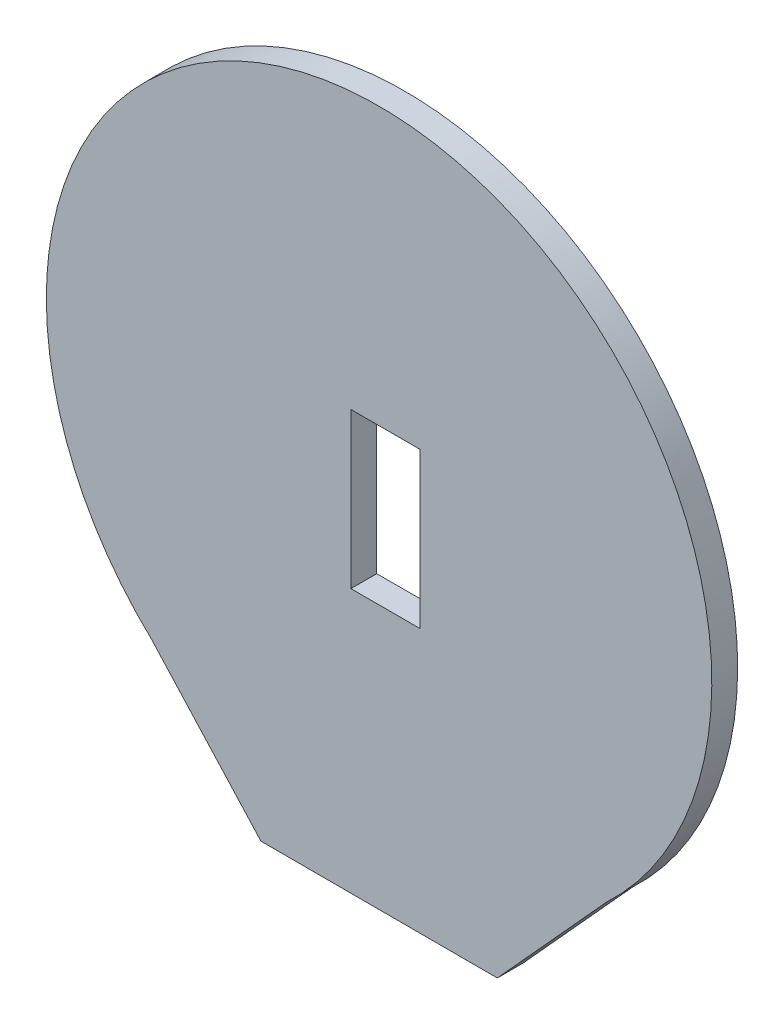
ISO-10303-21;
HEADER;
FILE_DESCRIPTION(('STEP AP214'),'2;1');
FILE_NAME('part.step','',(''),(''),'','','');
FILE_SCHEMA(('AUTOMOTIVE_DESIGN { 1 0 10303 214 1 1 1 1 }'));
ENDSEC;
DATA;
#1=APPLICATION_CONTEXT('core data for automotive mechanical design processes');
#2=APPLICATION_PROTOCOL_DEFINITION('international standard','automotive_design',2000,#1);
#3=PRODUCT_CONTEXT('',#1,'mechanical');
#4=PRODUCT('Part','Part','',(#3));
#5=PRODUCT_RELATED_PRODUCT_CATEGORY('part','',(#4));
#6=PRODUCT_DEFINITION_FORMATION('','',#4);
#7=PRODUCT_DEFINITION_CONTEXT('part definition',#1,'design');
#8=PRODUCT_DEFINITION('design','',#6,#7);
#9=PRODUCT_DEFINITION_SHAPE('','',#8);
#10=(LENGTH_UNIT() NAMED_UNIT(*) SI_UNIT(.MILLI.,.METRE.));
#11=(NAMED_UNIT(*) PLANE_ANGLE_UNIT() SI_UNIT($,.RADIAN.));
#12=(NAMED_UNIT(*) SI_UNIT($,.STERADIAN.) SOLID_ANGLE_UNIT());
#13=UNCERTAINTY_MEASURE_WITH_UNIT(LENGTH_MEASURE(1.E-05),#10,'distance_accuracy_value','');
#14=(GEOMETRIC_REPRESENTATION_CONTEXT(3) GLOBAL_UNCERTAINTY_ASSIGNED_CONTEXT((#13)) GLOBAL_UNIT_ASSIGNED_CONTEXT((#10,
#11,#12)) REPRESENTATION_CONTEXT('',''));
#15=CARTESIAN_POINT('',(0.,0.,0.));
#16=DIRECTION('',(0.,0.,1.));
#17=DIRECTION('',(1.,0.,0.));
#18=AXIS2_PLACEMENT_3D('',#15,#16,#17);
#19=CARTESIAN_POINT('',(-3.59774024797865,-21.8435557966853,1.5));
#20=DIRECTION('',(-0.740412562536273,0.672152688931964,0.));
#21=DIRECTION('',(-0.672152688931964,-0.740412562536273,0.));
#22=AXIS2_PLACEMENT_3D('',#19,#20,#21);
#23=PLANE('',#22);
#24=DIRECTION('',(0.672152688931964,0.740412562536273,0.));
#25=VECTOR('',#24,1.);
#26=CARTESIAN_POINT('',(-3.59774024797865,-21.8435557966853,0.));
#27=LINE('',#26,#25);
#28=CARTESIAN_POINT('',(-3.59774024797865,-21.8435557966853,0.));
#29=VERTEX_POINT('',#28);
#30=CARTESIAN_POINT('',(2.75790810704578,-14.8424651775278,0.));
#31=VERTEX_POINT('',#30);
#32=EDGE_CURVE('E125',#29,#31,#27,.T.);
#33=ORIENTED_EDGE('',*,*,#32,.T.);
#34=DIRECTION('',(0.,0.,-1.));
#35=VECTOR('',#34,1.);
#36=CARTESIAN_POINT('',(2.75790810704578,-14.8424651775278,1.5));
#37=LINE('',#36,#35);
#38=CARTESIAN_POINT('',(2.75790810704578,-14.8424651775278,1.5));
#39=VERTEX_POINT('',#38);
#40=EDGE_CURVE('E11',#39,#31,#37,.T.);
#41=ORIENTED_EDGE('',*,*,#40,.F.);
#42=DIRECTION('',(0.672152688931964,0.740412562536273,0.));
#43=VECTOR('',#42,1.);
#44=CARTESIAN_POINT('',(-3.59774024797865,-21.8435557966853,1.5));
#45=LINE('',#44,#43);
#46=CARTESIAN_POINT('',(-3.59774024797865,-21.8435557966853,1.5));
#47=VERTEX_POINT('',#46);
#48=EDGE_CURVE('E157',#47,#39,#45,.T.);
#49=ORIENTED_EDGE('',*,*,#48,.F.);
#50=DIRECTION('',(0.,0.,-1.));
#51=VECTOR('',#50,1.);
#52=CARTESIAN_POINT('',(-3.59774024797865,-21.8435557966853,1.5));
#53=LINE('',#52,#51);
#54=EDGE_CURVE('E172',#47,#29,#53,.T.);
#55=ORIENTED_EDGE('',*,*,#54,.T.);
#56=EDGE_LOOP('',(#33,#41,#49,#55));
#57=FACE_BOUND('',#56,.T.);
#58=ADVANCED_FACE('F44',(#57),#23,.F.);
#59=CARTESIAN_POINT('',(-10.4551158286561,-0.774558493355795,1.5));
#60=DIRECTION('',(0.,0.,-1.));
#61=DIRECTION('',(-1.,0.,0.));
#62=AXIS2_PLACEMENT_3D('',#59,#60,#61);
#63=CYLINDRICAL_SURFACE('',#62,19.3);
#64=CARTESIAN_POINT('',(-10.4551158286561,-0.774558493355795,0.));
#65=DIRECTION('',(0.,0.,1.));
#66=DIRECTION('',(1.,0.,0.));
#67=AXIS2_PLACEMENT_3D('',#64,#65,#66);
#68=CIRCLE('',#67,19.3);
#69=CARTESIAN_POINT('',(-23.6681397643578,-14.8424651775278,0.));
#70=VERTEX_POINT('',#69);
#71=EDGE_CURVE('E176',#31,#70,#68,.T.);
#72=ORIENTED_EDGE('',*,*,#71,.T.);
#73=DIRECTION('',(0.,0.,-1.));
#74=VECTOR('',#73,1.);
#75=CARTESIAN_POINT('',(-23.6681397643578,-14.8424651775278,1.5));
#76=LINE('',#75,#74);
#77=CARTESIAN_POINT('',(-23.6681397643578,-14.8424651775278,1.5));
#78=VERTEX_POINT('',#77);
#79=EDGE_CURVE('E52',#78,#70,#76,.T.);
#80=ORIENTED_EDGE('',*,*,#79,.F.);
#81=CARTESIAN_POINT('',(-10.4551158286561,-0.774558493355795,1.5));
#82=DIRECTION('',(0.,0.,1.));
#83=DIRECTION('',(1.,0.,0.));
#84=AXIS2_PLACEMENT_3D('',#81,#82,#83);
#85=CIRCLE('',#84,19.3);
#86=EDGE_CURVE('E161',#39,#78,#85,.T.);
#87=ORIENTED_EDGE('',*,*,#86,.F.);
#88=ORIENTED_EDGE('',*,*,#40,.T.);
#89=EDGE_LOOP('',(#72,#80,#87,#88));
#90=FACE_BOUND('',#89,.T.);
#91=ADVANCED_FACE('F198',(#90),#63,.T.);
#92=CARTESIAN_POINT('',(-17.3105207108081,-21.8238893763412,1.5));
#93=DIRECTION('',(-0.739366827981317,-0.673302824649389,0.));
#94=DIRECTION('',(0.673302824649389,-0.739366827981317,0.));
#95=AXIS2_PLACEMENT_3D('',#92,#93,#94);
#96=PLANE('',#95);
#97=DIRECTION('',(-0.673302824649389,0.739366827981317,0.));
#98=VECTOR('',#97,1.);
#99=CARTESIAN_POINT('',(-17.3105207108081,-21.8238893763412,0.));
#100=LINE('',#99,#98);
#101=CARTESIAN_POINT('',(-17.3105207108081,-21.8238893763412,0.));
#102=VERTEX_POINT('',#101);
#103=EDGE_CURVE('E180',#102,#70,#100,.T.);
#104=ORIENTED_EDGE('',*,*,#103,.F.);
#105=DIRECTION('',(0.,0.,-1.));
#106=VECTOR('',#105,1.);
#107=CARTESIAN_POINT('',(-17.3105207108081,-21.8238893763412,1.5));
#108=LINE('',#107,#106);
#109=CARTESIAN_POINT('',(-17.3105207108081,-21.8238893763412,1.5));
#110=VERTEX_POINT('',#109);
#111=EDGE_CURVE('E189',#110,#102,#108,.T.);
#112=ORIENTED_EDGE('',*,*,#111,.F.);
#113=DIRECTION('',(-0.673302824649389,0.739366827981317,0.));
#114=VECTOR('',#113,1.);
#115=CARTESIAN_POINT('',(-17.3105207108081,-21.8238893763412,1.5));
#116=LINE('',#115,#114);
#117=EDGE_CURVE('E165',#110,#78,#116,.T.);
#118=ORIENTED_EDGE('',*,*,#117,.T.);
#119=ORIENTED_EDGE('',*,*,#79,.T.);
#120=EDGE_LOOP('',(#104,#112,#118,#119));
#121=FACE_BOUND('',#120,.T.);
#122=ADVANCED_FACE('F195',(#121),#96,.T.);
#123=CARTESIAN_POINT('',(-17.3105207108081,-21.8238893763412,1.5));
#124=DIRECTION('',(0.00143416575304298,0.999998971583768,0.));
#125=DIRECTION('',(-0.999998971583768,0.00143416575304298,0.));
#126=AXIS2_PLACEMENT_3D('',#123,#124,#125);
#127=PLANE('',#126);
#128=DIRECTION('',(0.999998971583767,-0.00143416575304298,0.));
#129=VECTOR('',#128,1.);
#130=CARTESIAN_POINT('',(-17.3105207108081,-21.8238893763412,0.));
#131=LINE('',#130,#129);
#132=EDGE_CURVE('E162',#102,#29,#131,.T.);
#133=ORIENTED_EDGE('',*,*,#132,.T.);
#134=ORIENTED_EDGE('',*,*,#54,.F.);
#135=DIRECTION('',(0.999998971583767,-0.00143416575304298,0.));
#136=VECTOR('',#135,1.);
#137=CARTESIAN_POINT('',(-17.3105207108081,-21.8238893763412,1.5));
#138=LINE('',#137,#136);
#139=EDGE_CURVE('E169',#110,#47,#138,.T.);
#140=ORIENTED_EDGE('',*,*,#139,.F.);
#141=ORIENTED_EDGE('',*,*,#111,.T.);
#142=EDGE_LOOP('',(#133,#134,#140,#141));
#143=FACE_BOUND('',#142,.T.);
#144=ADVANCED_FACE('F204',(#143),#127,.F.);
#145=CARTESIAN_POINT('',(-10.4551158286561,-0.774558493355795,1.5));
#146=DIRECTION('',(0.,0.,1.));
#147=DIRECTION('',(1.,0.,0.));
#148=AXIS2_PLACEMENT_3D('',#145,#146,#147);
#149=PLANE('',#148);
#150=DIRECTION('',(0.,1.,0.));
#151=VECTOR('',#150,1.);
#152=CARTESIAN_POINT('',(-8.09047337493576,2.47048526373464,1.5));
#153=LINE('',#152,#151);
#154=CARTESIAN_POINT('',(-8.09047337493576,-6.52951473626536,1.5));
#155=VERTEX_POINT('',#154);
#156=CARTESIAN_POINT('',(-8.09047337493576,2.47048526373464,1.5));
#157=VERTEX_POINT('',#156);
#158=EDGE_CURVE('E59',#155,#157,#153,.T.);
#159=ORIENTED_EDGE('',*,*,#158,.F.);
#160=DIRECTION('',(1.,0.,0.));
#161=VECTOR('',#160,1.);
#162=CARTESIAN_POINT('',(-12.0904733749358,-6.52951473626536,1.5));
#163=LINE('',#162,#161);
#164=CARTESIAN_POINT('',(-12.0904733749358,-6.52951473626536,1.5));
#165=VERTEX_POINT('',#164);
#166=EDGE_CURVE('E118',#165,#155,#163,.T.);
#167=ORIENTED_EDGE('',*,*,#166,.F.);
#168=DIRECTION('',(0.,-1.,0.));
#169=VECTOR('',#168,1.);
#170=CARTESIAN_POINT('',(-12.0904733749358,2.47048526373464,1.5));
#171=LINE('',#170,#169);
#172=CARTESIAN_POINT('',(-12.0904733749358,2.47048526373464,1.5));
#173=VERTEX_POINT('',#172);
#174=EDGE_CURVE('E143',#173,#165,#171,.T.);
#175=ORIENTED_EDGE('',*,*,#174,.F.);
#176=DIRECTION('',(-1.,0.,0.));
#177=VECTOR('',#176,1.);
#178=CARTESIAN_POINT('',(-12.0904733749358,2.47048526373464,1.5));
#179=LINE('',#178,#177);
#180=EDGE_CURVE('E136',#157,#173,#179,.T.);
#181=ORIENTED_EDGE('',*,*,#180,.F.);
#182=EDGE_LOOP('',(#159,#167,#175,#181));
#183=FACE_BOUND('',#182,.T.);
#184=ORIENTED_EDGE('',*,*,#48,.T.);
#185=ORIENTED_EDGE('',*,*,#86,.T.);
#186=ORIENTED_EDGE('',*,*,#117,.F.);
#187=ORIENTED_EDGE('',*,*,#139,.T.);
#188=EDGE_LOOP('',(#184,#185,#186,#187));
#189=FACE_BOUND('',#188,.T.);
#190=ADVANCED_FACE('F209',(#183,#189),#149,.T.);
#191=CARTESIAN_POINT('',(-10.4551158286561,-0.774558493355795,0.));
#192=DIRECTION('',(0.,0.,1.));
#193=DIRECTION('',(1.,0.,0.));
#194=AXIS2_PLACEMENT_3D('',#191,#192,#193);
#195=PLANE('',#194);
#196=DIRECTION('',(-1.,0.,0.));
#197=VECTOR('',#196,1.);
#198=CARTESIAN_POINT('',(-12.0904733749358,-6.52951473626536,0.));
#199=LINE('',#198,#197);
#200=CARTESIAN_POINT('',(-8.09047337493576,-6.52951473626536,0.));
#201=VERTEX_POINT('',#200);
#202=CARTESIAN_POINT('',(-12.0904733749358,-6.52951473626536,0.));
#203=VERTEX_POINT('',#202);
#204=EDGE_CURVE('E131',#201,#203,#199,.T.);
#205=ORIENTED_EDGE('',*,*,#204,.F.);
#206=DIRECTION('',(0.,-1.,0.));
#207=VECTOR('',#206,1.);
#208=CARTESIAN_POINT('',(-8.09047337493576,2.47048526373464,0.));
#209=LINE('',#208,#207);
#210=CARTESIAN_POINT('',(-8.09047337493576,2.47048526373464,0.));
#211=VERTEX_POINT('',#210);
#212=EDGE_CURVE('E111',#211,#201,#209,.T.);
#213=ORIENTED_EDGE('',*,*,#212,.F.);
#214=DIRECTION('',(1.,0.,0.));
#215=VECTOR('',#214,1.);
#216=CARTESIAN_POINT('',(-12.0904733749358,2.47048526373464,0.));
#217=LINE('',#216,#215);
#218=CARTESIAN_POINT('',(-12.0904733749358,2.47048526373464,0.));
#219=VERTEX_POINT('',#218);
#220=EDGE_CURVE('E121',#219,#211,#217,.T.);
#221=ORIENTED_EDGE('',*,*,#220,.F.);
#222=DIRECTION('',(0.,1.,0.));
#223=VECTOR('',#222,1.);
#224=CARTESIAN_POINT('',(-12.0904733749358,2.47048526373464,0.));
#225=LINE('',#224,#223);
#226=EDGE_CURVE('E67',#203,#219,#225,.T.);
#227=ORIENTED_EDGE('',*,*,#226,.F.);
#228=EDGE_LOOP('',(#205,#213,#221,#227));
#229=FACE_BOUND('',#228,.T.);
#230=ORIENTED_EDGE('',*,*,#32,.F.);
#231=ORIENTED_EDGE('',*,*,#132,.F.);
#232=ORIENTED_EDGE('',*,*,#103,.T.);
#233=ORIENTED_EDGE('',*,*,#71,.F.);
#234=EDGE_LOOP('',(#230,#231,#232,#233));
#235=FACE_BOUND('',#234,.T.);
#236=ADVANCED_FACE('F128',(#229,#235),#195,.F.);
#237=CARTESIAN_POINT('',(-8.09047337493576,2.47048526373464,-0.000999999999999916));
#238=DIRECTION('',(1.,0.,0.));
#239=DIRECTION('',(0.,0.,-1.));
#240=AXIS2_PLACEMENT_3D('',#237,#238,#239);
#241=PLANE('',#240);
#242=ORIENTED_EDGE('',*,*,#212,.T.);
#243=DIRECTION('',(0.,0.,1.));
#244=VECTOR('',#243,1.);
#245=CARTESIAN_POINT('',(-8.09047337493576,-6.52951473626536,-0.000999999999999916));
#246=LINE('',#245,#244);
#247=EDGE_CURVE('E126',#201,#155,#246,.T.);
#248=ORIENTED_EDGE('',*,*,#247,.T.);
#249=ORIENTED_EDGE('',*,*,#158,.T.);
#250=DIRECTION('',(0.,0.,1.));
#251=VECTOR('',#250,1.);
#252=CARTESIAN_POINT('',(-8.09047337493576,2.47048526373464,-0.000999999999999916));
#253=LINE('',#252,#251);
#254=EDGE_CURVE('E107',#211,#157,#253,.T.);
#255=ORIENTED_EDGE('',*,*,#254,.F.);
#256=EDGE_LOOP('',(#242,#248,#249,#255));
#257=FACE_BOUND('',#256,.T.);
#258=ADVANCED_FACE('F109',(#257),#241,.F.);
#259=CARTESIAN_POINT('',(-12.0904733749358,-6.52951473626536,-0.000999999999999916));
#260=DIRECTION('',(0.,-1.,0.));
#261=DIRECTION('',(0.,0.,-1.));
#262=AXIS2_PLACEMENT_3D('',#259,#260,#261);
#263=PLANE('',#262);
#264=ORIENTED_EDGE('',*,*,#204,.T.);
#265=DIRECTION('',(0.,0.,1.));
#266=VECTOR('',#265,1.);
#267=CARTESIAN_POINT('',(-12.0904733749358,-6.52951473626536,-0.000999999999999916));
#268=LINE('',#267,#266);
#269=EDGE_CURVE('E152',#203,#165,#268,.T.);
#270=ORIENTED_EDGE('',*,*,#269,.T.);
#271=ORIENTED_EDGE('',*,*,#166,.T.);
#272=ORIENTED_EDGE('',*,*,#247,.F.);
#273=EDGE_LOOP('',(#264,#270,#271,#272));
#274=FACE_BOUND('',#273,.T.);
#275=ADVANCED_FACE('F256',(#274),#263,.F.);
#276=CARTESIAN_POINT('',(-12.0904733749358,2.47048526373464,-0.000999999999999916));
#277=DIRECTION('',(-1.,0.,0.));
#278=DIRECTION('',(0.,-1.,0.));
#279=AXIS2_PLACEMENT_3D('',#276,#277,#278);
#280=PLANE('',#279);
#281=ORIENTED_EDGE('',*,*,#226,.T.);
#282=DIRECTION('',(0.,0.,1.));
#283=VECTOR('',#282,1.);
#284=CARTESIAN_POINT('',(-12.0904733749358,2.47048526373464,-0.000999999999999916));
#285=LINE('',#284,#283);
#286=EDGE_CURVE('E117',#219,#173,#285,.T.);
#287=ORIENTED_EDGE('',*,*,#286,.T.);
#288=ORIENTED_EDGE('',*,*,#174,.T.);
#289=ORIENTED_EDGE('',*,*,#269,.F.);
#290=EDGE_LOOP('',(#281,#287,#288,#289));
#291=FACE_BOUND('',#290,.T.);
#292=ADVANCED_FACE('F265',(#291),#280,.F.);
#293=CARTESIAN_POINT('',(-12.0904733749358,2.47048526373464,-0.000999999999999916));
#294=DIRECTION('',(0.,1.,0.));
#295=DIRECTION('',(0.,0.,1.));
#296=AXIS2_PLACEMENT_3D('',#293,#294,#295);
#297=PLANE('',#296);
#298=ORIENTED_EDGE('',*,*,#220,.T.);
#299=ORIENTED_EDGE('',*,*,#254,.T.);
#300=ORIENTED_EDGE('',*,*,#180,.T.);
#301=ORIENTED_EDGE('',*,*,#286,.F.);
#302=EDGE_LOOP('',(#298,#299,#300,#301));
#303=FACE_BOUND('',#302,.T.);
#304=ADVANCED_FACE('F122',(#303),#297,.F.);
#305=CLOSED_SHELL('',(#58,#91,#122,#144,#190,#236,#258,#275,#292,#304));
#306=MANIFOLD_SOLID_BREP('B2',#305);
#307=ADVANCED_BREP_SHAPE_REPRESENTATION('',(#18,#306),#14);
#308=SHAPE_DEFINITION_REPRESENTATION(#9,#307);
ENDSEC;
END-ISO-10303-21;
